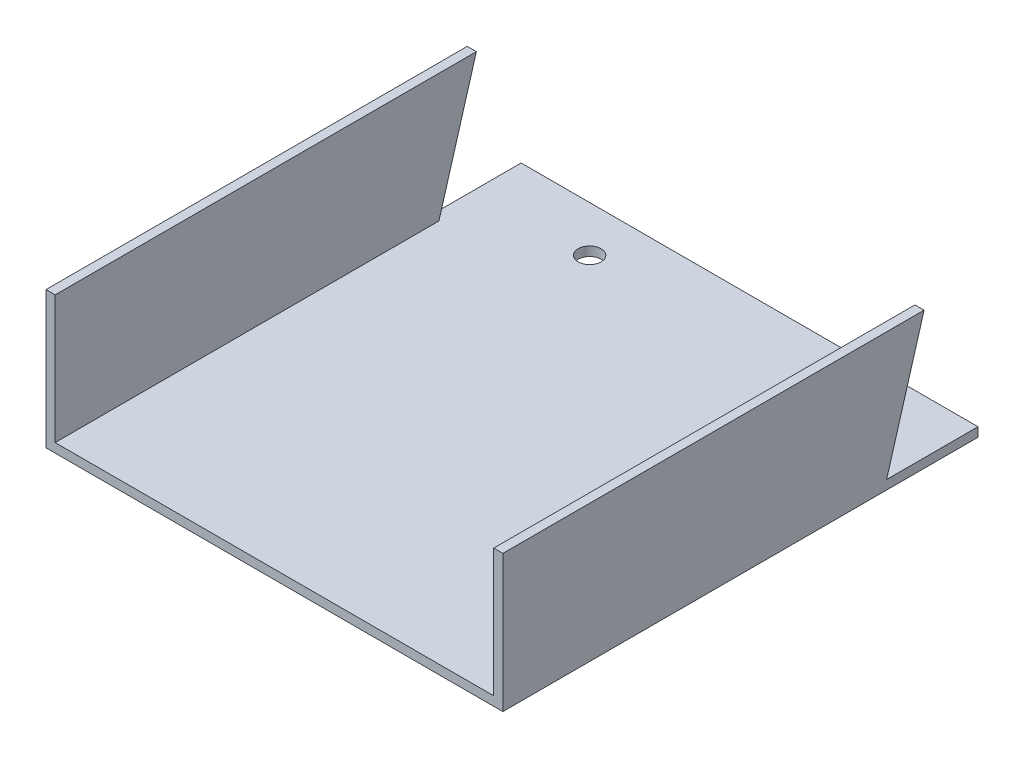
ISO-10303-21;
HEADER;
FILE_DESCRIPTION(('STEP AP214'),'2;1');
FILE_NAME('part.step','',(''),(''),'','','');
FILE_SCHEMA(('AUTOMOTIVE_DESIGN { 1 0 10303 214 1 1 1 1 }'));
ENDSEC;
DATA;
#1=APPLICATION_CONTEXT('core data for automotive mechanical design processes');
#2=APPLICATION_PROTOCOL_DEFINITION('international standard','automotive_design',2000,#1);
#3=PRODUCT_CONTEXT('',#1,'mechanical');
#4=PRODUCT('Part','Part','',(#3));
#5=PRODUCT_RELATED_PRODUCT_CATEGORY('part','',(#4));
#6=PRODUCT_DEFINITION_FORMATION('','',#4);
#7=PRODUCT_DEFINITION_CONTEXT('part definition',#1,'design');
#8=PRODUCT_DEFINITION('design','',#6,#7);
#9=PRODUCT_DEFINITION_SHAPE('','',#8);
#10=(LENGTH_UNIT() NAMED_UNIT(*) SI_UNIT(.MILLI.,.METRE.));
#11=(NAMED_UNIT(*) PLANE_ANGLE_UNIT() SI_UNIT($,.RADIAN.));
#12=(NAMED_UNIT(*) SI_UNIT($,.STERADIAN.) SOLID_ANGLE_UNIT());
#13=UNCERTAINTY_MEASURE_WITH_UNIT(LENGTH_MEASURE(1.E-05),#10,'distance_accuracy_value','');
#14=(GEOMETRIC_REPRESENTATION_CONTEXT(3) GLOBAL_UNCERTAINTY_ASSIGNED_CONTEXT((#13)) GLOBAL_UNIT_ASSIGNED_CONTEXT((#10,
#11,#12)) REPRESENTATION_CONTEXT('',''));
#15=CARTESIAN_POINT('',(0.,0.,0.));
#16=DIRECTION('',(0.,0.,1.));
#17=DIRECTION('',(1.,0.,0.));
#18=AXIS2_PLACEMENT_3D('',#15,#16,#17);
#19=CARTESIAN_POINT('',(127.,38.1,132.08));
#20=DIRECTION('',(0.,-1.,0.));
#21=DIRECTION('',(1.,0.,0.));
#22=AXIS2_PLACEMENT_3D('',#19,#20,#21);
#23=PLANE('',#22);
#24=DIRECTION('',(0.,0.,-1.));
#25=VECTOR('',#24,1.);
#26=CARTESIAN_POINT('',(127.,38.1,132.08));
#27=LINE('',#26,#25);
#28=CARTESIAN_POINT('',(127.,38.1,132.08));
#29=VERTEX_POINT('',#28);
#30=CARTESIAN_POINT('',(127.,38.1,14.986));
#31=VERTEX_POINT('',#30);
#32=EDGE_CURVE('E174',#29,#31,#27,.T.);
#33=ORIENTED_EDGE('',*,*,#32,.T.);
#34=DIRECTION('',(1.,0.,0.));
#35=VECTOR('',#34,1.);
#36=CARTESIAN_POINT('',(124.46,38.1,14.986));
#37=LINE('',#36,#35);
#38=CARTESIAN_POINT('',(124.46,38.1,14.986));
#39=VERTEX_POINT('',#38);
#40=EDGE_CURVE('E139',#39,#31,#37,.T.);
#41=ORIENTED_EDGE('',*,*,#40,.F.);
#42=DIRECTION('',(0.,0.,-1.));
#43=VECTOR('',#42,1.);
#44=CARTESIAN_POINT('',(124.46,38.1,25.4));
#45=LINE('',#44,#43);
#46=CARTESIAN_POINT('',(124.46,38.1,132.08));
#47=VERTEX_POINT('',#46);
#48=EDGE_CURVE('E137',#47,#39,#45,.T.);
#49=ORIENTED_EDGE('',*,*,#48,.F.);
#50=DIRECTION('',(-1.,0.,0.));
#51=VECTOR('',#50,1.);
#52=CARTESIAN_POINT('',(127.,38.1,132.08));
#53=LINE('',#52,#51);
#54=EDGE_CURVE('E165',#29,#47,#53,.T.);
#55=ORIENTED_EDGE('',*,*,#54,.F.);
#56=EDGE_LOOP('',(#33,#41,#49,#55));
#57=FACE_BOUND('',#56,.T.);
#58=ADVANCED_FACE('F37',(#57),#23,.F.);
#59=CARTESIAN_POINT('',(0.,0.,0.));
#60=DIRECTION('',(0.,0.,1.));
#61=DIRECTION('',(1.,0.,0.));
#62=AXIS2_PLACEMENT_3D('',#59,#60,#61);
#63=PLANE('',#62);
#64=DIRECTION('',(-1.,0.,0.));
#65=VECTOR('',#64,1.);
#66=CARTESIAN_POINT('',(127.,2.54000000000001,0.));
#67=LINE('',#66,#65);
#68=CARTESIAN_POINT('',(127.,2.53999999999999,0.));
#69=VERTEX_POINT('',#68);
#70=CARTESIAN_POINT('',(0.,2.53999999999997,0.));
#71=VERTEX_POINT('',#70);
#72=EDGE_CURVE('E183',#69,#71,#67,.T.);
#73=ORIENTED_EDGE('',*,*,#72,.F.);
#74=DIRECTION('',(0.,1.,0.));
#75=VECTOR('',#74,1.);
#76=CARTESIAN_POINT('',(127.,0.,0.));
#77=LINE('',#76,#75);
#78=CARTESIAN_POINT('',(127.,0.,0.));
#79=VERTEX_POINT('',#78);
#80=EDGE_CURVE('E161',#79,#69,#77,.T.);
#81=ORIENTED_EDGE('',*,*,#80,.F.);
#82=DIRECTION('',(1.,0.,0.));
#83=VECTOR('',#82,1.);
#84=CARTESIAN_POINT('',(0.,0.,0.));
#85=LINE('',#84,#83);
#86=CARTESIAN_POINT('',(0.,0.,0.));
#87=VERTEX_POINT('',#86);
#88=EDGE_CURVE('E77',#87,#79,#85,.T.);
#89=ORIENTED_EDGE('',*,*,#88,.F.);
#90=DIRECTION('',(0.,-1.,0.));
#91=VECTOR('',#90,1.);
#92=CARTESIAN_POINT('',(0.,38.1,0.));
#93=LINE('',#92,#91);
#94=EDGE_CURVE('E157',#71,#87,#93,.T.);
#95=ORIENTED_EDGE('',*,*,#94,.F.);
#96=EDGE_LOOP('',(#73,#81,#89,#95));
#97=FACE_BOUND('',#96,.T.);
#98=ADVANCED_FACE('F181',(#97),#63,.F.);
#99=CARTESIAN_POINT('',(0.,38.1,132.08));
#100=DIRECTION('',(1.,0.,0.));
#101=DIRECTION('',(0.,1.,0.));
#102=AXIS2_PLACEMENT_3D('',#99,#100,#101);
#103=PLANE('',#102);
#104=DIRECTION('',(0.,0.,-1.));
#105=VECTOR('',#104,1.);
#106=CARTESIAN_POINT('',(0.,38.1,132.08));
#107=LINE('',#106,#105);
#108=CARTESIAN_POINT('',(0.,38.1,132.08));
#109=VERTEX_POINT('',#108);
#110=CARTESIAN_POINT('',(0.,38.1,14.986));
#111=VERTEX_POINT('',#110);
#112=EDGE_CURVE('E168',#109,#111,#107,.T.);
#113=ORIENTED_EDGE('',*,*,#112,.T.);
#114=DIRECTION('',(0.,0.959692321040619,-0.281052751161895));
#115=VECTOR('',#114,1.);
#116=CARTESIAN_POINT('',(0.,2.54000000000001,25.4));
#117=LINE('',#116,#115);
#118=CARTESIAN_POINT('',(0.,2.54000000000001,25.4));
#119=VERTEX_POINT('',#118);
#120=EDGE_CURVE('E201',#119,#111,#117,.T.);
#121=ORIENTED_EDGE('',*,*,#120,.F.);
#122=DIRECTION('',(0.,0.,1.));
#123=VECTOR('',#122,1.);
#124=CARTESIAN_POINT('',(0.,2.53999999999997,0.));
#125=LINE('',#124,#123);
#126=EDGE_CURVE('E186',#71,#119,#125,.T.);
#127=ORIENTED_EDGE('',*,*,#126,.F.);
#128=ORIENTED_EDGE('',*,*,#94,.T.);
#129=DIRECTION('',(0.,0.,-1.));
#130=VECTOR('',#129,1.);
#131=CARTESIAN_POINT('',(0.,0.,132.08));
#132=LINE('',#131,#130);
#133=CARTESIAN_POINT('',(0.,0.,132.08));
#134=VERTEX_POINT('',#133);
#135=EDGE_CURVE('E11',#134,#87,#132,.T.);
#136=ORIENTED_EDGE('',*,*,#135,.F.);
#137=DIRECTION('',(0.,-1.,0.));
#138=VECTOR('',#137,1.);
#139=CARTESIAN_POINT('',(0.,38.1,132.08));
#140=LINE('',#139,#138);
#141=EDGE_CURVE('E159',#109,#134,#140,.T.);
#142=ORIENTED_EDGE('',*,*,#141,.F.);
#143=EDGE_LOOP('',(#113,#121,#127,#128,#136,#142));
#144=FACE_BOUND('',#143,.T.);
#145=ADVANCED_FACE('F39',(#144),#103,.F.);
#146=CARTESIAN_POINT('',(0.,0.,132.08));
#147=DIRECTION('',(0.,1.,0.));
#148=DIRECTION('',(0.,0.,1.));
#149=AXIS2_PLACEMENT_3D('',#146,#147,#148);
#150=PLANE('',#149);
#151=CARTESIAN_POINT('',(31.75,0.,12.7));
#152=DIRECTION('',(0.,1.,0.));
#153=DIRECTION('',(-1.,0.,0.));
#154=AXIS2_PLACEMENT_3D('',#151,#152,#153);
#155=CIRCLE('',#154,3.175);
#156=CARTESIAN_POINT('',(28.575,0.,12.7));
#157=VERTEX_POINT('',#156);
#158=EDGE_CURVE('E217',#157,#157,#155,.T.);
#159=ORIENTED_EDGE('',*,*,#158,.T.);
#160=EDGE_LOOP('',(#159));
#161=FACE_BOUND('',#160,.T.);
#162=CARTESIAN_POINT('',(95.25,0.,12.7));
#163=DIRECTION('',(0.,1.,0.));
#164=DIRECTION('',(-1.,0.,0.));
#165=AXIS2_PLACEMENT_3D('',#162,#163,#164);
#166=CIRCLE('',#165,3.175);
#167=CARTESIAN_POINT('',(92.075,0.,12.7));
#168=VERTEX_POINT('',#167);
#169=EDGE_CURVE('E224',#168,#168,#166,.T.);
#170=ORIENTED_EDGE('',*,*,#169,.T.);
#171=EDGE_LOOP('',(#170));
#172=FACE_BOUND('',#171,.T.);
#173=ORIENTED_EDGE('',*,*,#88,.T.);
#174=DIRECTION('',(0.,0.,-1.));
#175=VECTOR('',#174,1.);
#176=CARTESIAN_POINT('',(127.,0.,132.08));
#177=LINE('',#176,#175);
#178=CARTESIAN_POINT('',(127.,0.,132.08));
#179=VERTEX_POINT('',#178);
#180=EDGE_CURVE('E45',#179,#79,#177,.T.);
#181=ORIENTED_EDGE('',*,*,#180,.F.);
#182=DIRECTION('',(1.,0.,0.));
#183=VECTOR('',#182,1.);
#184=CARTESIAN_POINT('',(0.,0.,132.08));
#185=LINE('',#184,#183);
#186=EDGE_CURVE('E82',#134,#179,#185,.T.);
#187=ORIENTED_EDGE('',*,*,#186,.F.);
#188=ORIENTED_EDGE('',*,*,#135,.T.);
#189=EDGE_LOOP('',(#173,#181,#187,#188));
#190=FACE_BOUND('',#189,.T.);
#191=ADVANCED_FACE('F260',(#161,#172,#190),#150,.F.);
#192=CARTESIAN_POINT('',(127.,0.,132.08));
#193=DIRECTION('',(-1.,0.,0.));
#194=DIRECTION('',(0.,0.,1.));
#195=AXIS2_PLACEMENT_3D('',#192,#193,#194);
#196=PLANE('',#195);
#197=DIRECTION('',(0.,0.,-1.));
#198=VECTOR('',#197,1.);
#199=CARTESIAN_POINT('',(127.,2.54000000000001,25.4));
#200=LINE('',#199,#198);
#201=CARTESIAN_POINT('',(127.,2.54000000000001,25.4));
#202=VERTEX_POINT('',#201);
#203=EDGE_CURVE('E52',#202,#69,#200,.T.);
#204=ORIENTED_EDGE('',*,*,#203,.F.);
#205=DIRECTION('',(0.,0.959692321040619,-0.281052751161895));
#206=VECTOR('',#205,1.);
#207=CARTESIAN_POINT('',(127.,-28.5735378976552,34.5118218128847));
#208=LINE('',#207,#206);
#209=EDGE_CURVE('E128',#202,#31,#208,.T.);
#210=ORIENTED_EDGE('',*,*,#209,.T.);
#211=ORIENTED_EDGE('',*,*,#32,.F.);
#212=DIRECTION('',(0.,1.,0.));
#213=VECTOR('',#212,1.);
#214=CARTESIAN_POINT('',(127.,0.,132.08));
#215=LINE('',#214,#213);
#216=EDGE_CURVE('E163',#179,#29,#215,.T.);
#217=ORIENTED_EDGE('',*,*,#216,.F.);
#218=ORIENTED_EDGE('',*,*,#180,.T.);
#219=ORIENTED_EDGE('',*,*,#80,.T.);
#220=EDGE_LOOP('',(#204,#210,#211,#217,#218,#219));
#221=FACE_BOUND('',#220,.T.);
#222=ADVANCED_FACE('F178',(#221),#196,.F.);
#223=CARTESIAN_POINT('',(2.54000000000001,38.1,132.08));
#224=VERTEX_POINT('',#223);
#225=EDGE_CURVE('E61',#224,#109,#53,.T.);
#226=ORIENTED_EDGE('',*,*,#225,.F.);
#227=DIRECTION('',(0.,0.,1.));
#228=VECTOR('',#227,1.);
#229=CARTESIAN_POINT('',(2.54,38.1,25.4));
#230=LINE('',#229,#228);
#231=CARTESIAN_POINT('',(2.54,38.1,14.986));
#232=VERTEX_POINT('',#231);
#233=EDGE_CURVE('E151',#232,#224,#230,.T.);
#234=ORIENTED_EDGE('',*,*,#233,.F.);
#235=DIRECTION('',(-1.,0.,0.));
#236=VECTOR('',#235,1.);
#237=CARTESIAN_POINT('',(2.54,38.1,14.986));
#238=LINE('',#237,#236);
#239=EDGE_CURVE('E153',#232,#111,#238,.T.);
#240=ORIENTED_EDGE('',*,*,#239,.T.);
#241=ORIENTED_EDGE('',*,*,#112,.F.);
#242=EDGE_LOOP('',(#226,#234,#240,#241));
#243=FACE_BOUND('',#242,.T.);
#244=ADVANCED_FACE('F211',(#243),#23,.F.);
#245=CARTESIAN_POINT('',(0.,0.,132.08));
#246=DIRECTION('',(0.,0.,1.));
#247=DIRECTION('',(1.,0.,0.));
#248=AXIS2_PLACEMENT_3D('',#245,#246,#247);
#249=PLANE('',#248);
#250=DIRECTION('',(0.,1.,0.));
#251=VECTOR('',#250,1.);
#252=CARTESIAN_POINT('',(124.46,2.54000000000001,132.08));
#253=LINE('',#252,#251);
#254=CARTESIAN_POINT('',(124.46,2.54000000000001,132.08));
#255=VERTEX_POINT('',#254);
#256=EDGE_CURVE('E155',#255,#47,#253,.T.);
#257=ORIENTED_EDGE('',*,*,#256,.F.);
#258=DIRECTION('',(1.,0.,0.));
#259=VECTOR('',#258,1.);
#260=CARTESIAN_POINT('',(2.54000000000003,2.53999999999997,132.08));
#261=LINE('',#260,#259);
#262=CARTESIAN_POINT('',(2.54000000000003,2.53999999999997,132.08));
#263=VERTEX_POINT('',#262);
#264=EDGE_CURVE('E144',#263,#255,#261,.T.);
#265=ORIENTED_EDGE('',*,*,#264,.F.);
#266=DIRECTION('',(0.,1.,0.));
#267=VECTOR('',#266,1.);
#268=CARTESIAN_POINT('',(2.54000000000003,2.53999999999997,132.08));
#269=LINE('',#268,#267);
#270=EDGE_CURVE('E130',#263,#224,#269,.T.);
#271=ORIENTED_EDGE('',*,*,#270,.T.);
#272=ORIENTED_EDGE('',*,*,#225,.T.);
#273=ORIENTED_EDGE('',*,*,#141,.T.);
#274=ORIENTED_EDGE('',*,*,#186,.T.);
#275=ORIENTED_EDGE('',*,*,#216,.T.);
#276=ORIENTED_EDGE('',*,*,#54,.T.);
#277=EDGE_LOOP('',(#257,#265,#271,#272,#273,#274,#275,#276));
#278=FACE_BOUND('',#277,.T.);
#279=ADVANCED_FACE('F198',(#278),#249,.T.);
#280=CARTESIAN_POINT('',(124.46,2.54000000000001,25.4));
#281=DIRECTION('',(1.,0.,0.));
#282=DIRECTION('',(0.,1.,0.));
#283=AXIS2_PLACEMENT_3D('',#280,#281,#282);
#284=PLANE('',#283);
#285=ORIENTED_EDGE('',*,*,#48,.T.);
#286=DIRECTION('',(0.,0.959692321040619,-0.281052751161895));
#287=VECTOR('',#286,1.);
#288=CARTESIAN_POINT('',(124.46,-28.5735378976552,34.5118218128847));
#289=LINE('',#288,#287);
#290=CARTESIAN_POINT('',(124.46,2.54000000000002,25.4));
#291=VERTEX_POINT('',#290);
#292=EDGE_CURVE('E126',#291,#39,#289,.T.);
#293=ORIENTED_EDGE('',*,*,#292,.F.);
#294=DIRECTION('',(0.,0.,-1.));
#295=VECTOR('',#294,1.);
#296=CARTESIAN_POINT('',(124.46,2.54000000000001,25.4));
#297=LINE('',#296,#295);
#298=EDGE_CURVE('E131',#255,#291,#297,.T.);
#299=ORIENTED_EDGE('',*,*,#298,.F.);
#300=ORIENTED_EDGE('',*,*,#256,.T.);
#301=EDGE_LOOP('',(#285,#293,#299,#300));
#302=FACE_BOUND('',#301,.T.);
#303=ADVANCED_FACE('F134',(#302),#284,.F.);
#304=CARTESIAN_POINT('',(2.54000000000001,2.53999999999997,25.4));
#305=DIRECTION('',(-1.,0.,0.));
#306=DIRECTION('',(0.,-1.,0.));
#307=AXIS2_PLACEMENT_3D('',#304,#305,#306);
#308=PLANE('',#307);
#309=ORIENTED_EDGE('',*,*,#233,.T.);
#310=ORIENTED_EDGE('',*,*,#270,.F.);
#311=DIRECTION('',(0.,0.,1.));
#312=VECTOR('',#311,1.);
#313=CARTESIAN_POINT('',(2.54000000000001,2.53999999999997,25.4));
#314=LINE('',#313,#312);
#315=CARTESIAN_POINT('',(2.54000000000001,2.53999999999997,25.4));
#316=VERTEX_POINT('',#315);
#317=EDGE_CURVE('E147',#316,#263,#314,.T.);
#318=ORIENTED_EDGE('',*,*,#317,.F.);
#319=DIRECTION('',(0.,0.959692321040619,-0.281052751161895));
#320=VECTOR('',#319,1.);
#321=CARTESIAN_POINT('',(2.54,2.54000000000001,25.4));
#322=LINE('',#321,#320);
#323=EDGE_CURVE('E204',#316,#232,#322,.T.);
#324=ORIENTED_EDGE('',*,*,#323,.T.);
#325=EDGE_LOOP('',(#309,#310,#318,#324));
#326=FACE_BOUND('',#325,.T.);
#327=ADVANCED_FACE('F236',(#326),#308,.F.);
#328=CARTESIAN_POINT('',(0.,2.53999999999997,0.));
#329=DIRECTION('',(0.,1.,0.));
#330=DIRECTION('',(-1.,0.,0.));
#331=AXIS2_PLACEMENT_3D('',#328,#329,#330);
#332=PLANE('',#331);
#333=CARTESIAN_POINT('',(31.75,2.53999999999998,12.7));
#334=DIRECTION('',(0.,1.,0.));
#335=DIRECTION('',(-1.,0.,0.));
#336=AXIS2_PLACEMENT_3D('',#333,#334,#335);
#337=CIRCLE('',#336,3.175);
#338=CARTESIAN_POINT('',(28.575,2.53999999999998,12.7));
#339=VERTEX_POINT('',#338);
#340=EDGE_CURVE('E219',#339,#339,#337,.T.);
#341=ORIENTED_EDGE('',*,*,#340,.F.);
#342=EDGE_LOOP('',(#341));
#343=FACE_BOUND('',#342,.T.);
#344=CARTESIAN_POINT('',(95.25,2.54,12.7));
#345=DIRECTION('',(0.,1.,0.));
#346=DIRECTION('',(-1.,0.,0.));
#347=AXIS2_PLACEMENT_3D('',#344,#345,#346);
#348=CIRCLE('',#347,3.175);
#349=CARTESIAN_POINT('',(92.075,2.54,12.7));
#350=VERTEX_POINT('',#349);
#351=EDGE_CURVE('E229',#350,#350,#348,.T.);
#352=ORIENTED_EDGE('',*,*,#351,.F.);
#353=EDGE_LOOP('',(#352));
#354=FACE_BOUND('',#353,.T.);
#355=ORIENTED_EDGE('',*,*,#203,.T.);
#356=ORIENTED_EDGE('',*,*,#72,.T.);
#357=ORIENTED_EDGE('',*,*,#126,.T.);
#358=DIRECTION('',(1.,0.,0.));
#359=VECTOR('',#358,1.);
#360=CARTESIAN_POINT('',(0.,2.53999999999997,25.4));
#361=LINE('',#360,#359);
#362=EDGE_CURVE('E188',#119,#316,#361,.T.);
#363=ORIENTED_EDGE('',*,*,#362,.T.);
#364=ORIENTED_EDGE('',*,*,#317,.T.);
#365=ORIENTED_EDGE('',*,*,#264,.T.);
#366=ORIENTED_EDGE('',*,*,#298,.T.);
#367=DIRECTION('',(1.,0.,0.));
#368=VECTOR('',#367,1.);
#369=CARTESIAN_POINT('',(127.,2.54000000000001,25.4));
#370=LINE('',#369,#368);
#371=EDGE_CURVE('E122',#291,#202,#370,.T.);
#372=ORIENTED_EDGE('',*,*,#371,.T.);
#373=EDGE_LOOP('',(#355,#356,#357,#363,#364,#365,#366,#372));
#374=FACE_BOUND('',#373,.T.);
#375=ADVANCED_FACE('F141',(#343,#354,#374),#332,.T.);
#376=CARTESIAN_POINT('',(2.54,2.54000000000001,25.4));
#377=DIRECTION('',(0.,0.281052751161895,0.959692321040619));
#378=DIRECTION('',(0.,-0.959692321040619,0.281052751161895));
#379=AXIS2_PLACEMENT_3D('',#376,#377,#378);
#380=PLANE('',#379);
#381=ORIENTED_EDGE('',*,*,#120,.T.);
#382=ORIENTED_EDGE('',*,*,#239,.F.);
#383=ORIENTED_EDGE('',*,*,#323,.F.);
#384=ORIENTED_EDGE('',*,*,#362,.F.);
#385=EDGE_LOOP('',(#381,#382,#383,#384));
#386=FACE_BOUND('',#385,.T.);
#387=ADVANCED_FACE('F214',(#386),#380,.F.);
#388=CARTESIAN_POINT('',(124.46,-28.5735378976552,34.5118218128847));
#389=DIRECTION('',(0.,-0.281052751161895,-0.959692321040619));
#390=DIRECTION('',(0.,0.959692321040619,-0.281052751161895));
#391=AXIS2_PLACEMENT_3D('',#388,#389,#390);
#392=PLANE('',#391);
#393=ORIENTED_EDGE('',*,*,#209,.F.);
#394=ORIENTED_EDGE('',*,*,#371,.F.);
#395=ORIENTED_EDGE('',*,*,#292,.T.);
#396=ORIENTED_EDGE('',*,*,#40,.T.);
#397=EDGE_LOOP('',(#393,#394,#395,#396));
#398=FACE_BOUND('',#397,.T.);
#399=ADVANCED_FACE('F124',(#398),#392,.T.);
#400=CARTESIAN_POINT('',(95.25,0.,12.7));
#401=DIRECTION('',(0.,1.,0.));
#402=DIRECTION('',(-1.,0.,0.));
#403=AXIS2_PLACEMENT_3D('',#400,#401,#402);
#404=CYLINDRICAL_SURFACE('',#403,3.175);
#405=ORIENTED_EDGE('',*,*,#169,.F.);
#406=EDGE_LOOP('',(#405));
#407=FACE_BOUND('',#406,.T.);
#408=ORIENTED_EDGE('',*,*,#351,.T.);
#409=EDGE_LOOP('',(#408));
#410=FACE_BOUND('',#409,.T.);
#411=ADVANCED_FACE('F233',(#407,#410),#404,.F.);
#412=CARTESIAN_POINT('',(31.75,0.,12.7));
#413=DIRECTION('',(0.,1.,0.));
#414=DIRECTION('',(-1.,0.,0.));
#415=AXIS2_PLACEMENT_3D('',#412,#413,#414);
#416=CYLINDRICAL_SURFACE('',#415,3.175);
#417=ORIENTED_EDGE('',*,*,#158,.F.);
#418=EDGE_LOOP('',(#417));
#419=FACE_BOUND('',#418,.T.);
#420=ORIENTED_EDGE('',*,*,#340,.T.);
#421=EDGE_LOOP('',(#420));
#422=FACE_BOUND('',#421,.T.);
#423=ADVANCED_FACE('F271',(#419,#422),#416,.F.);
#424=CLOSED_SHELL('',(#58,#98,#145,#191,#222,#244,#279,#303,#327,#375,#387,#399,#411,#423));
#425=MANIFOLD_SOLID_BREP('B2',#424);
#426=ADVANCED_BREP_SHAPE_REPRESENTATION('',(#18,#425),#14);
#427=SHAPE_DEFINITION_REPRESENTATION(#9,#426);
ENDSEC;
END-ISO-10303-21;
